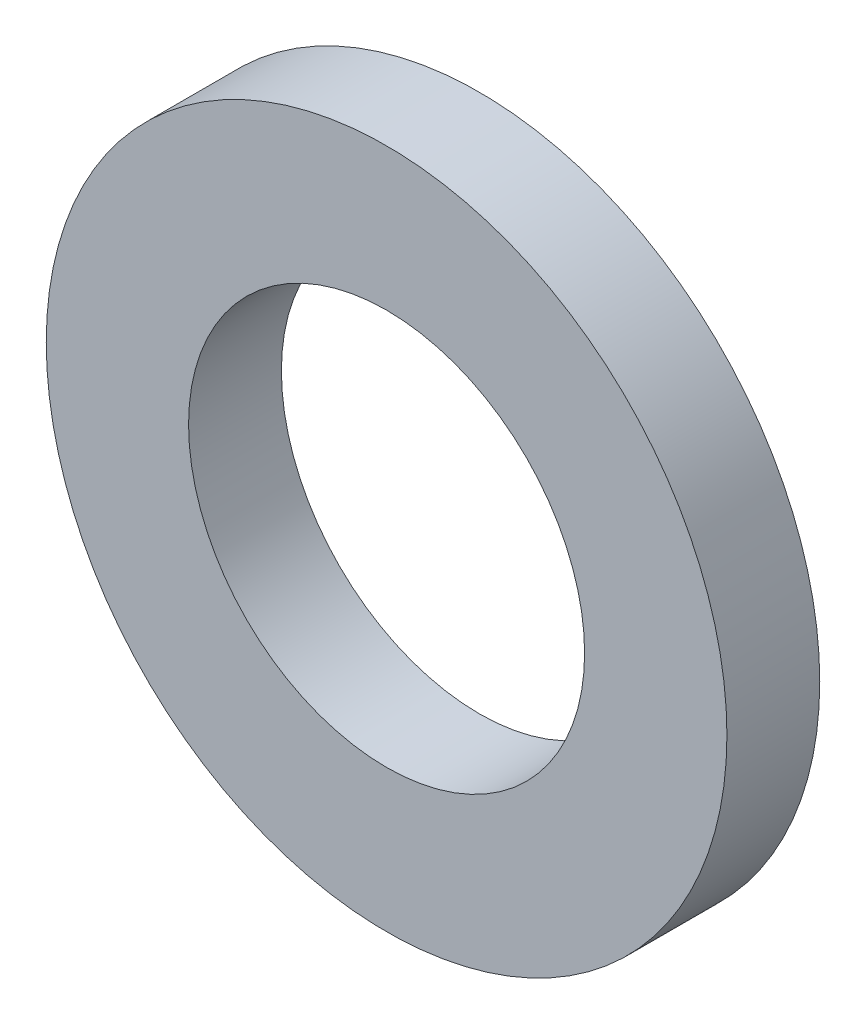
ISO-10303-21;
HEADER;
FILE_DESCRIPTION(('STEP AP214'),'2;1');
FILE_NAME('part.step','',(''),(''),'','','');
FILE_SCHEMA(('AUTOMOTIVE_DESIGN { 1 0 10303 214 1 1 1 1 }'));
ENDSEC;
DATA;
#1=APPLICATION_CONTEXT('core data for automotive mechanical design processes');
#2=APPLICATION_PROTOCOL_DEFINITION('international standard','automotive_design',2000,#1);
#3=PRODUCT_CONTEXT('',#1,'mechanical');
#4=PRODUCT('Part','Part','',(#3));
#5=PRODUCT_RELATED_PRODUCT_CATEGORY('part','',(#4));
#6=PRODUCT_DEFINITION_FORMATION('','',#4);
#7=PRODUCT_DEFINITION_CONTEXT('part definition',#1,'design');
#8=PRODUCT_DEFINITION('design','',#6,#7);
#9=PRODUCT_DEFINITION_SHAPE('','',#8);
#10=(LENGTH_UNIT() NAMED_UNIT(*) SI_UNIT(.MILLI.,.METRE.));
#11=(NAMED_UNIT(*) PLANE_ANGLE_UNIT() SI_UNIT($,.RADIAN.));
#12=(NAMED_UNIT(*) SI_UNIT($,.STERADIAN.) SOLID_ANGLE_UNIT());
#13=UNCERTAINTY_MEASURE_WITH_UNIT(LENGTH_MEASURE(1.E-05),#10,'distance_accuracy_value','');
#14=(GEOMETRIC_REPRESENTATION_CONTEXT(3) GLOBAL_UNCERTAINTY_ASSIGNED_CONTEXT((#13)) GLOBAL_UNIT_ASSIGNED_CONTEXT((#10,
#11,#12)) REPRESENTATION_CONTEXT('',''));
#15=CARTESIAN_POINT('',(0.,0.,0.));
#16=DIRECTION('',(0.,0.,1.));
#17=DIRECTION('',(1.,0.,0.));
#18=AXIS2_PLACEMENT_3D('',#15,#16,#17);
#19=CARTESIAN_POINT('',(0.,0.,1.5));
#20=DIRECTION('',(0.,0.,1.));
#21=DIRECTION('',(1.,0.,0.));
#22=AXIS2_PLACEMENT_3D('',#19,#20,#21);
#23=PLANE('',#22);
#24=CARTESIAN_POINT('',(0.,0.,1.5));
#25=DIRECTION('',(0.,0.,1.));
#26=DIRECTION('',(1.,0.,0.));
#27=AXIS2_PLACEMENT_3D('',#24,#25,#26);
#28=CIRCLE('',#27,5.5);
#29=CARTESIAN_POINT('',(5.5,0.,1.5));
#30=VERTEX_POINT('',#29);
#31=EDGE_CURVE('E10',#30,#30,#28,.T.);
#32=ORIENTED_EDGE('',*,*,#31,.T.);
#33=EDGE_LOOP('',(#32));
#34=FACE_BOUND('',#33,.T.);
#35=CARTESIAN_POINT('',(0.,0.,1.5));
#36=DIRECTION('',(0.,0.,1.));
#37=DIRECTION('',(1.,0.,0.));
#38=AXIS2_PLACEMENT_3D('',#35,#36,#37);
#39=CIRCLE('',#38,3.2);
#40=CARTESIAN_POINT('',(3.2,0.,1.5));
#41=VERTEX_POINT('',#40);
#42=EDGE_CURVE('E50',#41,#41,#39,.T.);
#43=ORIENTED_EDGE('',*,*,#42,.F.);
#44=EDGE_LOOP('',(#43));
#45=FACE_BOUND('',#44,.T.);
#46=ADVANCED_FACE('F37',(#34,#45),#23,.T.);
#47=CARTESIAN_POINT('',(0.,0.,0.));
#48=DIRECTION('',(0.,0.,1.));
#49=DIRECTION('',(1.,0.,0.));
#50=AXIS2_PLACEMENT_3D('',#47,#48,#49);
#51=PLANE('',#50);
#52=CARTESIAN_POINT('',(0.,0.,0.));
#53=DIRECTION('',(0.,0.,1.));
#54=DIRECTION('',(1.,0.,0.));
#55=AXIS2_PLACEMENT_3D('',#52,#53,#54);
#56=CIRCLE('',#55,5.5);
#57=CARTESIAN_POINT('',(5.5,0.,0.));
#58=VERTEX_POINT('',#57);
#59=EDGE_CURVE('E41',#58,#58,#56,.T.);
#60=ORIENTED_EDGE('',*,*,#59,.F.);
#61=EDGE_LOOP('',(#60));
#62=FACE_BOUND('',#61,.T.);
#63=CARTESIAN_POINT('',(0.,0.,0.));
#64=DIRECTION('',(0.,0.,1.));
#65=DIRECTION('',(1.,0.,0.));
#66=AXIS2_PLACEMENT_3D('',#63,#64,#65);
#67=CIRCLE('',#66,3.2);
#68=CARTESIAN_POINT('',(3.2,0.,0.));
#69=VERTEX_POINT('',#68);
#70=EDGE_CURVE('E52',#69,#69,#67,.T.);
#71=ORIENTED_EDGE('',*,*,#70,.T.);
#72=EDGE_LOOP('',(#71));
#73=FACE_BOUND('',#72,.T.);
#74=ADVANCED_FACE('F64',(#62,#73),#51,.F.);
#75=CARTESIAN_POINT('',(0.,0.,1.5));
#76=DIRECTION('',(0.,0.,-1.));
#77=DIRECTION('',(-1.,0.,0.));
#78=AXIS2_PLACEMENT_3D('',#75,#76,#77);
#79=CYLINDRICAL_SURFACE('',#78,5.5);
#80=ORIENTED_EDGE('',*,*,#31,.F.);
#81=EDGE_LOOP('',(#80));
#82=FACE_BOUND('',#81,.T.);
#83=ORIENTED_EDGE('',*,*,#59,.T.);
#84=EDGE_LOOP('',(#83));
#85=FACE_BOUND('',#84,.T.);
#86=ADVANCED_FACE('F39',(#82,#85),#79,.T.);
#87=CARTESIAN_POINT('',(0.,0.,1.5));
#88=DIRECTION('',(0.,0.,-1.));
#89=DIRECTION('',(-1.,0.,0.));
#90=AXIS2_PLACEMENT_3D('',#87,#88,#89);
#91=CYLINDRICAL_SURFACE('',#90,3.2);
#92=ORIENTED_EDGE('',*,*,#42,.T.);
#93=EDGE_LOOP('',(#92));
#94=FACE_BOUND('',#93,.T.);
#95=ORIENTED_EDGE('',*,*,#70,.F.);
#96=EDGE_LOOP('',(#95));
#97=FACE_BOUND('',#96,.T.);
#98=ADVANCED_FACE('F60',(#94,#97),#91,.F.);
#99=CLOSED_SHELL('',(#46,#74,#86,#98));
#100=MANIFOLD_SOLID_BREP('B2',#99);
#101=ADVANCED_BREP_SHAPE_REPRESENTATION('',(#18,#100),#14);
#102=SHAPE_DEFINITION_REPRESENTATION(#9,#101);
ENDSEC;
END-ISO-10303-21;
